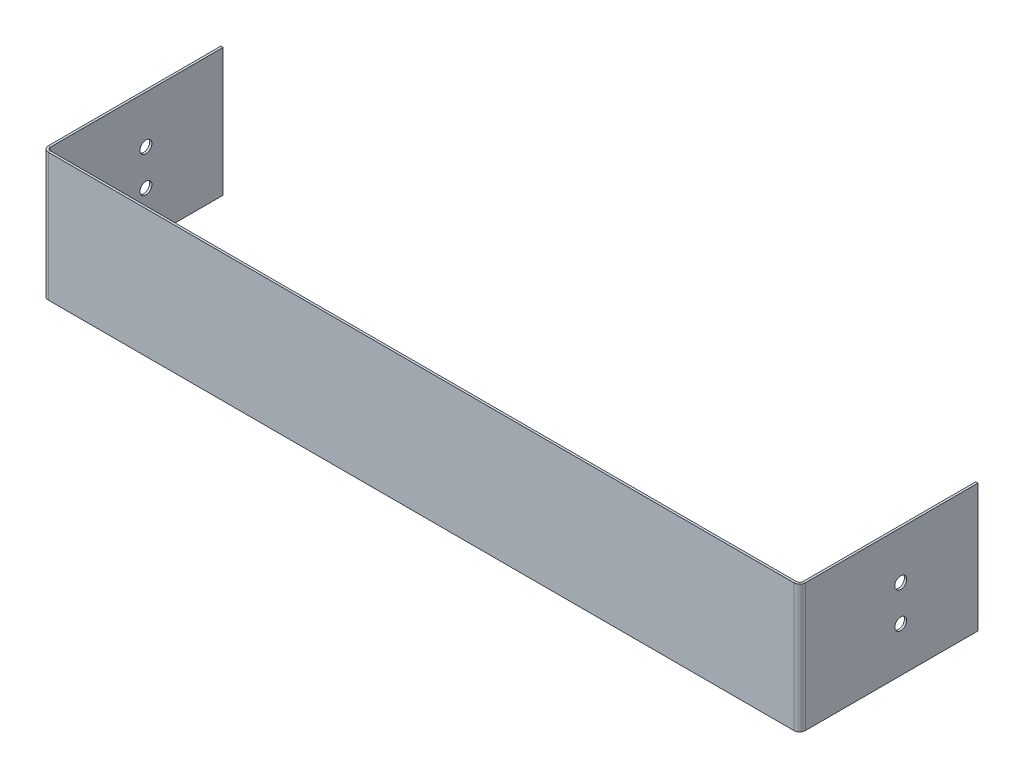
ISO-10303-21;
HEADER;
FILE_DESCRIPTION(('STEP AP214'),'2;1');
FILE_NAME('part.step','',(''),(''),'','','');
FILE_SCHEMA(('AUTOMOTIVE_DESIGN { 1 0 10303 214 1 1 1 1 }'));
ENDSEC;
DATA;
#1=APPLICATION_CONTEXT('core data for automotive mechanical design processes');
#2=APPLICATION_PROTOCOL_DEFINITION('international standard','automotive_design',2000,#1);
#3=PRODUCT_CONTEXT('',#1,'mechanical');
#4=PRODUCT('Part','Part','',(#3));
#5=PRODUCT_RELATED_PRODUCT_CATEGORY('part','',(#4));
#6=PRODUCT_DEFINITION_FORMATION('','',#4);
#7=PRODUCT_DEFINITION_CONTEXT('part definition',#1,'design');
#8=PRODUCT_DEFINITION('design','',#6,#7);
#9=PRODUCT_DEFINITION_SHAPE('','',#8);
#10=(LENGTH_UNIT() NAMED_UNIT(*) SI_UNIT(.MILLI.,.METRE.));
#11=(NAMED_UNIT(*) PLANE_ANGLE_UNIT() SI_UNIT($,.RADIAN.));
#12=(NAMED_UNIT(*) SI_UNIT($,.STERADIAN.) SOLID_ANGLE_UNIT());
#13=UNCERTAINTY_MEASURE_WITH_UNIT(LENGTH_MEASURE(1.E-05),#10,'distance_accuracy_value','');
#14=(GEOMETRIC_REPRESENTATION_CONTEXT(3) GLOBAL_UNCERTAINTY_ASSIGNED_CONTEXT((#13)) GLOBAL_UNIT_ASSIGNED_CONTEXT((#10,
#11,#12)) REPRESENTATION_CONTEXT('',''));
#15=CARTESIAN_POINT('',(0.,0.,0.));
#16=DIRECTION('',(0.,0.,1.));
#17=DIRECTION('',(1.,0.,0.));
#18=AXIS2_PLACEMENT_3D('',#15,#16,#17);
#19=CARTESIAN_POINT('',(0.,0.,-0.4826));
#20=DIRECTION('',(0.,0.,1.));
#21=DIRECTION('',(1.,0.,0.));
#22=AXIS2_PLACEMENT_3D('',#19,#20,#21);
#23=PLANE('',#22);
#24=DIRECTION('',(0.,1.,0.));
#25=VECTOR('',#24,1.);
#26=CARTESIAN_POINT('',(1.2192,27.3545977178884,-0.4826));
#27=LINE('',#26,#25);
#28=CARTESIAN_POINT('',(1.2192,27.3545977178884,-0.4826));
#29=VERTEX_POINT('',#28);
#30=CARTESIAN_POINT('',(1.2192,0.,-0.4826));
#31=VERTEX_POINT('',#30);
#32=EDGE_CURVE('E264',#29,#31,#27,.F.);
#33=ORIENTED_EDGE('',*,*,#32,.F.);
#34=DIRECTION('',(-1.,0.,0.));
#35=VECTOR('',#34,1.);
#36=CARTESIAN_POINT('',(161.72997796623,27.3545977178884,-0.4826));
#37=LINE('',#36,#35);
#38=CARTESIAN_POINT('',(160.51077796623,27.3545977178884,-0.482600000000002));
#39=VERTEX_POINT('',#38);
#40=EDGE_CURVE('E13',#39,#29,#37,.T.);
#41=ORIENTED_EDGE('',*,*,#40,.F.);
#42=DIRECTION('',(0.,-1.,0.));
#43=VECTOR('',#42,1.);
#44=CARTESIAN_POINT('',(160.51077796623,0.,-0.482600000000002));
#45=LINE('',#44,#43);
#46=CARTESIAN_POINT('',(160.51077796623,0.,-0.482600000000002));
#47=VERTEX_POINT('',#46);
#48=EDGE_CURVE('E148',#47,#39,#45,.F.);
#49=ORIENTED_EDGE('',*,*,#48,.F.);
#50=DIRECTION('',(1.,0.,0.));
#51=VECTOR('',#50,1.);
#52=CARTESIAN_POINT('',(0.,0.,-0.4826));
#53=LINE('',#52,#51);
#54=EDGE_CURVE('E88',#31,#47,#53,.T.);
#55=ORIENTED_EDGE('',*,*,#54,.F.);
#56=EDGE_LOOP('',(#33,#41,#49,#55));
#57=FACE_BOUND('',#56,.T.);
#58=ADVANCED_FACE('F79',(#57),#23,.F.);
#59=CARTESIAN_POINT('',(0.,0.,0.));
#60=DIRECTION('',(0.,0.,1.));
#61=DIRECTION('',(1.,0.,0.));
#62=AXIS2_PLACEMENT_3D('',#59,#60,#61);
#63=PLANE('',#62);
#64=DIRECTION('',(-1.,0.,0.));
#65=VECTOR('',#64,1.);
#66=CARTESIAN_POINT('',(161.72997796623,27.3545977178884,0.));
#67=LINE('',#66,#65);
#68=CARTESIAN_POINT('',(160.51077796623,27.3545977178884,0.));
#69=VERTEX_POINT('',#68);
#70=CARTESIAN_POINT('',(1.2192,27.3545977178884,0.));
#71=VERTEX_POINT('',#70);
#72=EDGE_CURVE('E186',#69,#71,#67,.T.);
#73=ORIENTED_EDGE('',*,*,#72,.T.);
#74=DIRECTION('',(0.,1.,0.));
#75=VECTOR('',#74,1.);
#76=CARTESIAN_POINT('',(1.2192,27.3545977178884,0.));
#77=LINE('',#76,#75);
#78=CARTESIAN_POINT('',(1.2192,0.,0.));
#79=VERTEX_POINT('',#78);
#80=EDGE_CURVE('E252',#71,#79,#77,.F.);
#81=ORIENTED_EDGE('',*,*,#80,.T.);
#82=DIRECTION('',(1.,0.,0.));
#83=VECTOR('',#82,1.);
#84=CARTESIAN_POINT('',(0.,0.,0.));
#85=LINE('',#84,#83);
#86=CARTESIAN_POINT('',(160.51077796623,0.,0.));
#87=VERTEX_POINT('',#86);
#88=EDGE_CURVE('E105',#79,#87,#85,.T.);
#89=ORIENTED_EDGE('',*,*,#88,.T.);
#90=DIRECTION('',(0.,-1.,0.));
#91=VECTOR('',#90,1.);
#92=CARTESIAN_POINT('',(160.51077796623,0.,0.));
#93=LINE('',#92,#91);
#94=EDGE_CURVE('E176',#87,#69,#93,.F.);
#95=ORIENTED_EDGE('',*,*,#94,.T.);
#96=EDGE_LOOP('',(#73,#81,#89,#95));
#97=FACE_BOUND('',#96,.T.);
#98=ADVANCED_FACE('F325',(#97),#63,.T.);
#99=CARTESIAN_POINT('',(161.72997796623,27.3545977178884,-0.4826));
#100=DIRECTION('',(0.,1.,0.));
#101=DIRECTION('',(-1.,0.,0.));
#102=AXIS2_PLACEMENT_3D('',#99,#100,#101);
#103=PLANE('',#102);
#104=ORIENTED_EDGE('',*,*,#40,.T.);
#105=DIRECTION('',(0.,0.,1.));
#106=VECTOR('',#105,1.);
#107=CARTESIAN_POINT('',(1.2192,27.3545977178884,-0.4826));
#108=LINE('',#107,#106);
#109=EDGE_CURVE('E258',#29,#71,#108,.T.);
#110=ORIENTED_EDGE('',*,*,#109,.T.);
#111=ORIENTED_EDGE('',*,*,#72,.F.);
#112=DIRECTION('',(0.,0.,1.));
#113=VECTOR('',#112,1.);
#114=CARTESIAN_POINT('',(160.51077796623,27.3545977178884,-0.482600000000002));
#115=LINE('',#114,#113);
#116=EDGE_CURVE('E183',#39,#69,#115,.T.);
#117=ORIENTED_EDGE('',*,*,#116,.F.);
#118=EDGE_LOOP('',(#104,#110,#111,#117));
#119=FACE_BOUND('',#118,.T.);
#120=ADVANCED_FACE('F331',(#119),#103,.T.);
#121=CARTESIAN_POINT('',(0.,0.,-0.4826));
#122=DIRECTION('',(0.,-1.,0.));
#123=DIRECTION('',(0.,0.,-1.));
#124=AXIS2_PLACEMENT_3D('',#121,#122,#123);
#125=PLANE('',#124);
#126=DIRECTION('',(0.,0.,1.));
#127=VECTOR('',#126,1.);
#128=CARTESIAN_POINT('',(1.2192,0.,-0.4826));
#129=LINE('',#128,#127);
#130=EDGE_CURVE('E175',#31,#79,#129,.T.);
#131=ORIENTED_EDGE('',*,*,#130,.F.);
#132=ORIENTED_EDGE('',*,*,#54,.T.);
#133=DIRECTION('',(0.,0.,1.));
#134=VECTOR('',#133,1.);
#135=CARTESIAN_POINT('',(160.51077796623,0.,-0.482600000000002));
#136=LINE('',#135,#134);
#137=EDGE_CURVE('E147',#47,#87,#136,.T.);
#138=ORIENTED_EDGE('',*,*,#137,.T.);
#139=ORIENTED_EDGE('',*,*,#88,.F.);
#140=EDGE_LOOP('',(#131,#132,#138,#139));
#141=FACE_BOUND('',#140,.T.);
#142=ADVANCED_FACE('F81',(#141),#125,.T.);
#143=CARTESIAN_POINT('',(160.51077796623,27.3545977178884,-1.21920000000001));
#144=DIRECTION('',(0.,1.,0.));
#145=DIRECTION('',(0.,0.,1.));
#146=AXIS2_PLACEMENT_3D('',#143,#144,#145);
#147=PLANE('',#146);
#148=DIRECTION('',(-1.,0.,0.));
#149=VECTOR('',#148,1.);
#150=CARTESIAN_POINT('',(161.72997796623,27.3545977178884,-1.2192));
#151=LINE('',#150,#149);
#152=CARTESIAN_POINT('',(161.24737796623,27.3545977178884,-1.2192));
#153=VERTEX_POINT('',#152);
#154=CARTESIAN_POINT('',(161.72997796623,27.3545977178884,-1.2192));
#155=VERTEX_POINT('',#154);
#156=EDGE_CURVE('E136',#153,#155,#151,.F.);
#157=ORIENTED_EDGE('',*,*,#156,.F.);
#158=CARTESIAN_POINT('',(160.51077796623,27.3545977178884,-1.21920000000001));
#159=DIRECTION('',(0.,-1.,0.));
#160=DIRECTION('',(0.,0.,-1.));
#161=AXIS2_PLACEMENT_3D('',#158,#159,#160);
#162=CIRCLE('',#161,0.736600000000004);
#163=EDGE_CURVE('E130',#39,#153,#162,.F.);
#164=ORIENTED_EDGE('',*,*,#163,.F.);
#165=ORIENTED_EDGE('',*,*,#116,.T.);
#166=CARTESIAN_POINT('',(160.51077796623,27.3545977178884,-1.21920000000001));
#167=DIRECTION('',(0.,-1.,0.));
#168=DIRECTION('',(0.,0.,-1.));
#169=AXIS2_PLACEMENT_3D('',#166,#167,#168);
#170=CIRCLE('',#169,1.2192);
#171=EDGE_CURVE('E96',#69,#155,#170,.F.);
#172=ORIENTED_EDGE('',*,*,#171,.T.);
#173=EDGE_LOOP('',(#157,#164,#165,#172));
#174=FACE_BOUND('',#173,.T.);
#175=ADVANCED_FACE('F341',(#174),#147,.T.);
#176=CARTESIAN_POINT('',(160.51077796623,0.,-1.21920000000001));
#177=DIRECTION('',(0.,1.,0.));
#178=DIRECTION('',(0.,0.,1.));
#179=AXIS2_PLACEMENT_3D('',#176,#177,#178);
#180=PLANE('',#179);
#181=CARTESIAN_POINT('',(160.51077796623,0.,-1.21920000000001));
#182=DIRECTION('',(0.,-1.,0.));
#183=DIRECTION('',(0.,0.,-1.));
#184=AXIS2_PLACEMENT_3D('',#181,#182,#183);
#185=CIRCLE('',#184,0.736600000000004);
#186=CARTESIAN_POINT('',(161.24737796623,0.,-1.2192));
#187=VERTEX_POINT('',#186);
#188=EDGE_CURVE('E127',#187,#47,#185,.T.);
#189=ORIENTED_EDGE('',*,*,#188,.F.);
#190=DIRECTION('',(-1.,0.,0.));
#191=VECTOR('',#190,1.);
#192=CARTESIAN_POINT('',(161.24737796623,0.,-1.2192));
#193=LINE('',#192,#191);
#194=CARTESIAN_POINT('',(161.72997796623,0.,-1.2192));
#195=VERTEX_POINT('',#194);
#196=EDGE_CURVE('E135',#187,#195,#193,.F.);
#197=ORIENTED_EDGE('',*,*,#196,.T.);
#198=CARTESIAN_POINT('',(160.51077796623,0.,-1.21920000000001));
#199=DIRECTION('',(0.,-1.,0.));
#200=DIRECTION('',(0.,0.,-1.));
#201=AXIS2_PLACEMENT_3D('',#198,#199,#200);
#202=CIRCLE('',#201,1.2192);
#203=EDGE_CURVE('E178',#195,#87,#202,.T.);
#204=ORIENTED_EDGE('',*,*,#203,.T.);
#205=ORIENTED_EDGE('',*,*,#137,.F.);
#206=EDGE_LOOP('',(#189,#197,#204,#205));
#207=FACE_BOUND('',#206,.T.);
#208=ADVANCED_FACE('F142',(#207),#180,.F.);
#209=CARTESIAN_POINT('',(160.51077796623,0.,-1.21920000000001));
#210=DIRECTION('',(0.,-1.,0.));
#211=DIRECTION('',(1.,0.,0.));
#212=AXIS2_PLACEMENT_3D('',#209,#210,#211);
#213=CYLINDRICAL_SURFACE('',#212,1.2192);
#214=ORIENTED_EDGE('',*,*,#94,.F.);
#215=ORIENTED_EDGE('',*,*,#203,.F.);
#216=DIRECTION('',(0.,-1.,0.));
#217=VECTOR('',#216,1.);
#218=CARTESIAN_POINT('',(161.72997796623,27.3545977178884,-1.2192));
#219=LINE('',#218,#217);
#220=EDGE_CURVE('E161',#195,#155,#219,.F.);
#221=ORIENTED_EDGE('',*,*,#220,.T.);
#222=ORIENTED_EDGE('',*,*,#171,.F.);
#223=EDGE_LOOP('',(#214,#215,#221,#222));
#224=FACE_BOUND('',#223,.T.);
#225=ADVANCED_FACE('F394',(#224),#213,.T.);
#226=CARTESIAN_POINT('',(160.51077796623,0.,-1.21920000000001));
#227=DIRECTION('',(0.,-1.,0.));
#228=DIRECTION('',(1.,0.,0.));
#229=AXIS2_PLACEMENT_3D('',#226,#227,#228);
#230=CYLINDRICAL_SURFACE('',#229,0.736600000000004);
#231=ORIENTED_EDGE('',*,*,#48,.T.);
#232=ORIENTED_EDGE('',*,*,#163,.T.);
#233=DIRECTION('',(0.,-1.,0.));
#234=VECTOR('',#233,1.);
#235=CARTESIAN_POINT('',(161.24737796623,27.3545977178884,-1.2192));
#236=LINE('',#235,#234);
#237=EDGE_CURVE('E124',#153,#187,#236,.T.);
#238=ORIENTED_EDGE('',*,*,#237,.T.);
#239=ORIENTED_EDGE('',*,*,#188,.T.);
#240=EDGE_LOOP('',(#231,#232,#238,#239));
#241=FACE_BOUND('',#240,.T.);
#242=ADVANCED_FACE('F126',(#241),#230,.F.);
#243=CARTESIAN_POINT('',(161.72997796623,0.,-38.1));
#244=DIRECTION('',(0.,1.,0.));
#245=DIRECTION('',(0.,0.,1.));
#246=AXIS2_PLACEMENT_3D('',#243,#244,#245);
#247=PLANE('',#246);
#248=ORIENTED_EDGE('',*,*,#196,.F.);
#249=DIRECTION('',(0.,0.,1.));
#250=VECTOR('',#249,1.);
#251=CARTESIAN_POINT('',(161.24737796623,0.,-38.1));
#252=LINE('',#251,#250);
#253=CARTESIAN_POINT('',(161.24737796623,0.,-38.1));
#254=VERTEX_POINT('',#253);
#255=EDGE_CURVE('E157',#187,#254,#252,.F.);
#256=ORIENTED_EDGE('',*,*,#255,.T.);
#257=DIRECTION('',(-1.,0.,0.));
#258=VECTOR('',#257,1.);
#259=CARTESIAN_POINT('',(161.72997796623,0.,-38.1));
#260=LINE('',#259,#258);
#261=CARTESIAN_POINT('',(161.72997796623,0.,-38.1));
#262=VERTEX_POINT('',#261);
#263=EDGE_CURVE('E149',#262,#254,#260,.T.);
#264=ORIENTED_EDGE('',*,*,#263,.F.);
#265=DIRECTION('',(0.,0.,-1.));
#266=VECTOR('',#265,1.);
#267=CARTESIAN_POINT('',(161.72997796623,0.,5.98338217553696E-13));
#268=LINE('',#267,#266);
#269=EDGE_CURVE('E160',#195,#262,#268,.T.);
#270=ORIENTED_EDGE('',*,*,#269,.F.);
#271=EDGE_LOOP('',(#248,#256,#264,#270));
#272=FACE_BOUND('',#271,.T.);
#273=ADVANCED_FACE('F154',(#272),#247,.F.);
#274=CARTESIAN_POINT('',(161.72997796623,27.3545977178884,-0.482599999999998));
#275=DIRECTION('',(0.,-1.,0.));
#276=DIRECTION('',(0.,0.,-1.));
#277=AXIS2_PLACEMENT_3D('',#274,#275,#276);
#278=PLANE('',#277);
#279=ORIENTED_EDGE('',*,*,#156,.T.);
#280=DIRECTION('',(0.,0.,1.));
#281=VECTOR('',#280,1.);
#282=CARTESIAN_POINT('',(161.72997796623,27.3545977178884,5.98338217553696E-13));
#283=LINE('',#282,#281);
#284=CARTESIAN_POINT('',(161.72997796623,27.3545977178884,-38.1));
#285=VERTEX_POINT('',#284);
#286=EDGE_CURVE('E277',#285,#155,#283,.T.);
#287=ORIENTED_EDGE('',*,*,#286,.F.);
#288=DIRECTION('',(-1.,0.,0.));
#289=VECTOR('',#288,1.);
#290=CARTESIAN_POINT('',(161.72997796623,27.3545977178884,-38.1));
#291=LINE('',#290,#289);
#292=CARTESIAN_POINT('',(161.24737796623,27.3545977178884,-38.1));
#293=VERTEX_POINT('',#292);
#294=EDGE_CURVE('E274',#285,#293,#291,.T.);
#295=ORIENTED_EDGE('',*,*,#294,.T.);
#296=DIRECTION('',(0.,0.,-1.));
#297=VECTOR('',#296,1.);
#298=CARTESIAN_POINT('',(161.24737796623,27.3545977178884,-0.4826));
#299=LINE('',#298,#297);
#300=EDGE_CURVE('E168',#293,#153,#299,.F.);
#301=ORIENTED_EDGE('',*,*,#300,.T.);
#302=EDGE_LOOP('',(#279,#287,#295,#301));
#303=FACE_BOUND('',#302,.T.);
#304=ADVANCED_FACE('F284',(#303),#278,.F.);
#305=CARTESIAN_POINT('',(161.72997796623,0.,5.98338217553696E-13));
#306=DIRECTION('',(-1.,0.,0.));
#307=DIRECTION('',(0.,0.,1.));
#308=AXIS2_PLACEMENT_3D('',#305,#306,#307);
#309=PLANE('',#308);
#310=CARTESIAN_POINT('',(161.72997796623,17.1945977178884,-21.59));
#311=DIRECTION('',(1.,0.,0.));
#312=DIRECTION('',(0.,0.,-1.));
#313=AXIS2_PLACEMENT_3D('',#310,#311,#312);
#314=CIRCLE('',#313,1.27);
#315=CARTESIAN_POINT('',(161.72997796623,17.1945977178884,-22.86));
#316=VERTEX_POINT('',#315);
#317=EDGE_CURVE('E199',#316,#316,#314,.T.);
#318=ORIENTED_EDGE('',*,*,#317,.F.);
#319=EDGE_LOOP('',(#318));
#320=FACE_BOUND('',#319,.T.);
#321=CARTESIAN_POINT('',(161.72997796623,9.57459771788842,-21.59));
#322=DIRECTION('',(1.,0.,0.));
#323=DIRECTION('',(0.,0.,-1.));
#324=AXIS2_PLACEMENT_3D('',#321,#322,#323);
#325=CIRCLE('',#324,1.27);
#326=CARTESIAN_POINT('',(161.72997796623,9.57459771788842,-22.86));
#327=VERTEX_POINT('',#326);
#328=EDGE_CURVE('E209',#327,#327,#325,.T.);
#329=ORIENTED_EDGE('',*,*,#328,.F.);
#330=EDGE_LOOP('',(#329));
#331=FACE_BOUND('',#330,.T.);
#332=ORIENTED_EDGE('',*,*,#220,.F.);
#333=ORIENTED_EDGE('',*,*,#269,.T.);
#334=DIRECTION('',(0.,1.,0.));
#335=VECTOR('',#334,1.);
#336=CARTESIAN_POINT('',(161.72997796623,0.,-38.1));
#337=LINE('',#336,#335);
#338=EDGE_CURVE('E280',#262,#285,#337,.T.);
#339=ORIENTED_EDGE('',*,*,#338,.T.);
#340=ORIENTED_EDGE('',*,*,#286,.T.);
#341=EDGE_LOOP('',(#332,#333,#339,#340));
#342=FACE_BOUND('',#341,.T.);
#343=ADVANCED_FACE('F308',(#320,#331,#342),#309,.F.);
#344=CARTESIAN_POINT('',(161.24737796623,0.,5.9665322865957E-13));
#345=DIRECTION('',(-1.,0.,0.));
#346=DIRECTION('',(0.,0.,1.));
#347=AXIS2_PLACEMENT_3D('',#344,#345,#346);
#348=PLANE('',#347);
#349=CARTESIAN_POINT('',(161.24737796623,17.1945977178884,-21.59));
#350=DIRECTION('',(-1.,0.,0.));
#351=DIRECTION('',(0.,0.,1.));
#352=AXIS2_PLACEMENT_3D('',#349,#350,#351);
#353=CIRCLE('',#352,1.27);
#354=CARTESIAN_POINT('',(161.24737796623,17.1945977178884,-20.32));
#355=VERTEX_POINT('',#354);
#356=EDGE_CURVE('E212',#355,#355,#353,.T.);
#357=ORIENTED_EDGE('',*,*,#356,.F.);
#358=EDGE_LOOP('',(#357));
#359=FACE_BOUND('',#358,.T.);
#360=CARTESIAN_POINT('',(161.24737796623,9.57459771788842,-21.59));
#361=DIRECTION('',(-1.,0.,0.));
#362=DIRECTION('',(0.,0.,1.));
#363=AXIS2_PLACEMENT_3D('',#360,#361,#362);
#364=CIRCLE('',#363,1.27);
#365=CARTESIAN_POINT('',(161.24737796623,9.57459771788842,-20.32));
#366=VERTEX_POINT('',#365);
#367=EDGE_CURVE('E192',#366,#366,#364,.T.);
#368=ORIENTED_EDGE('',*,*,#367,.F.);
#369=EDGE_LOOP('',(#368));
#370=FACE_BOUND('',#369,.T.);
#371=ORIENTED_EDGE('',*,*,#255,.F.);
#372=ORIENTED_EDGE('',*,*,#237,.F.);
#373=ORIENTED_EDGE('',*,*,#300,.F.);
#374=DIRECTION('',(0.,-1.,0.));
#375=VECTOR('',#374,1.);
#376=CARTESIAN_POINT('',(161.24737796623,27.3545977178884,-38.1));
#377=LINE('',#376,#375);
#378=EDGE_CURVE('E165',#254,#293,#377,.F.);
#379=ORIENTED_EDGE('',*,*,#378,.F.);
#380=EDGE_LOOP('',(#371,#372,#373,#379));
#381=FACE_BOUND('',#380,.T.);
#382=ADVANCED_FACE('F163',(#359,#370,#381),#348,.T.);
#383=CARTESIAN_POINT('',(161.72997796623,27.3545977178884,-38.1));
#384=DIRECTION('',(0.,0.,1.));
#385=DIRECTION('',(1.,0.,0.));
#386=AXIS2_PLACEMENT_3D('',#383,#384,#385);
#387=PLANE('',#386);
#388=ORIENTED_EDGE('',*,*,#378,.T.);
#389=ORIENTED_EDGE('',*,*,#294,.F.);
#390=ORIENTED_EDGE('',*,*,#338,.F.);
#391=ORIENTED_EDGE('',*,*,#263,.T.);
#392=EDGE_LOOP('',(#388,#389,#390,#391));
#393=FACE_BOUND('',#392,.T.);
#394=ADVANCED_FACE('F309',(#393),#387,.F.);
#395=CARTESIAN_POINT('',(1.2192,0.,-1.2192));
#396=DIRECTION('',(0.,-1.,0.));
#397=DIRECTION('',(0.,0.,-1.));
#398=AXIS2_PLACEMENT_3D('',#395,#396,#397);
#399=PLANE('',#398);
#400=DIRECTION('',(1.,0.,0.));
#401=VECTOR('',#400,1.);
#402=CARTESIAN_POINT('',(0.,0.,-1.2192));
#403=LINE('',#402,#401);
#404=CARTESIAN_POINT('',(0.482599999999997,0.,-1.2192));
#405=VERTEX_POINT('',#404);
#406=CARTESIAN_POINT('',(0.,0.,-1.2192));
#407=VERTEX_POINT('',#406);
#408=EDGE_CURVE('E215',#405,#407,#403,.F.);
#409=ORIENTED_EDGE('',*,*,#408,.F.);
#410=CARTESIAN_POINT('',(1.2192,0.,-1.2192));
#411=DIRECTION('',(0.,1.,0.));
#412=DIRECTION('',(0.,0.,1.));
#413=AXIS2_PLACEMENT_3D('',#410,#411,#412);
#414=CIRCLE('',#413,0.7366);
#415=EDGE_CURVE('E261',#31,#405,#414,.F.);
#416=ORIENTED_EDGE('',*,*,#415,.F.);
#417=ORIENTED_EDGE('',*,*,#130,.T.);
#418=CARTESIAN_POINT('',(1.2192,0.,-1.2192));
#419=DIRECTION('',(0.,1.,0.));
#420=DIRECTION('',(0.,0.,1.));
#421=AXIS2_PLACEMENT_3D('',#418,#419,#420);
#422=CIRCLE('',#421,1.2192);
#423=EDGE_CURVE('E254',#79,#407,#422,.F.);
#424=ORIENTED_EDGE('',*,*,#423,.T.);
#425=EDGE_LOOP('',(#409,#416,#417,#424));
#426=FACE_BOUND('',#425,.T.);
#427=ADVANCED_FACE('F311',(#426),#399,.T.);
#428=CARTESIAN_POINT('',(1.2192,27.3545977178884,-1.2192));
#429=DIRECTION('',(0.,-1.,0.));
#430=DIRECTION('',(0.,0.,-1.));
#431=AXIS2_PLACEMENT_3D('',#428,#429,#430);
#432=PLANE('',#431);
#433=CARTESIAN_POINT('',(1.2192,27.3545977178884,-1.2192));
#434=DIRECTION('',(0.,1.,0.));
#435=DIRECTION('',(0.,0.,1.));
#436=AXIS2_PLACEMENT_3D('',#433,#434,#435);
#437=CIRCLE('',#436,0.7366);
#438=CARTESIAN_POINT('',(0.482599999999997,27.3545977178884,-1.2192));
#439=VERTEX_POINT('',#438);
#440=EDGE_CURVE('E219',#439,#29,#437,.T.);
#441=ORIENTED_EDGE('',*,*,#440,.F.);
#442=DIRECTION('',(1.,0.,0.));
#443=VECTOR('',#442,1.);
#444=CARTESIAN_POINT('',(0.482599999999997,27.3545977178884,-1.2192));
#445=LINE('',#444,#443);
#446=CARTESIAN_POINT('',(0.,27.3545977178884,-1.2192));
#447=VERTEX_POINT('',#446);
#448=EDGE_CURVE('E244',#439,#447,#445,.F.);
#449=ORIENTED_EDGE('',*,*,#448,.T.);
#450=CARTESIAN_POINT('',(1.2192,27.3545977178884,-1.2192));
#451=DIRECTION('',(0.,1.,0.));
#452=DIRECTION('',(0.,0.,1.));
#453=AXIS2_PLACEMENT_3D('',#450,#451,#452);
#454=CIRCLE('',#453,1.2192);
#455=EDGE_CURVE('E255',#447,#71,#454,.T.);
#456=ORIENTED_EDGE('',*,*,#455,.T.);
#457=ORIENTED_EDGE('',*,*,#109,.F.);
#458=EDGE_LOOP('',(#441,#449,#456,#457));
#459=FACE_BOUND('',#458,.T.);
#460=ADVANCED_FACE('F317',(#459),#432,.F.);
#461=CARTESIAN_POINT('',(1.2192,27.3545977178884,-1.2192));
#462=DIRECTION('',(0.,1.,0.));
#463=DIRECTION('',(-1.,0.,0.));
#464=AXIS2_PLACEMENT_3D('',#461,#462,#463);
#465=CYLINDRICAL_SURFACE('',#464,1.2192);
#466=ORIENTED_EDGE('',*,*,#80,.F.);
#467=ORIENTED_EDGE('',*,*,#455,.F.);
#468=DIRECTION('',(0.,1.,0.));
#469=VECTOR('',#468,1.);
#470=CARTESIAN_POINT('',(0.,0.,-1.2192));
#471=LINE('',#470,#469);
#472=EDGE_CURVE('E241',#447,#407,#471,.F.);
#473=ORIENTED_EDGE('',*,*,#472,.T.);
#474=ORIENTED_EDGE('',*,*,#423,.F.);
#475=EDGE_LOOP('',(#466,#467,#473,#474));
#476=FACE_BOUND('',#475,.T.);
#477=ADVANCED_FACE('F393',(#476),#465,.T.);
#478=CARTESIAN_POINT('',(1.2192,27.3545977178884,-1.2192));
#479=DIRECTION('',(0.,1.,0.));
#480=DIRECTION('',(-1.,0.,0.));
#481=AXIS2_PLACEMENT_3D('',#478,#479,#480);
#482=CYLINDRICAL_SURFACE('',#481,0.7366);
#483=ORIENTED_EDGE('',*,*,#32,.T.);
#484=ORIENTED_EDGE('',*,*,#415,.T.);
#485=DIRECTION('',(0.,1.,0.));
#486=VECTOR('',#485,1.);
#487=CARTESIAN_POINT('',(0.482599999999997,0.,-1.2192));
#488=LINE('',#487,#486);
#489=EDGE_CURVE('E247',#405,#439,#488,.T.);
#490=ORIENTED_EDGE('',*,*,#489,.T.);
#491=ORIENTED_EDGE('',*,*,#440,.T.);
#492=EDGE_LOOP('',(#483,#484,#490,#491));
#493=FACE_BOUND('',#492,.T.);
#494=ADVANCED_FACE('F353',(#493),#482,.F.);
#495=CARTESIAN_POINT('',(-1.31351093196619E-13,27.3545977178884,-38.1));
#496=DIRECTION('',(0.,-1.,0.));
#497=DIRECTION('',(0.,0.,-1.));
#498=AXIS2_PLACEMENT_3D('',#495,#496,#497);
#499=PLANE('',#498);
#500=ORIENTED_EDGE('',*,*,#448,.F.);
#501=DIRECTION('',(0.,0.,1.));
#502=VECTOR('',#501,1.);
#503=CARTESIAN_POINT('',(0.482599999999869,27.3545977178884,-38.1));
#504=LINE('',#503,#502);
#505=CARTESIAN_POINT('',(0.482599999999869,27.3545977178884,-38.1));
#506=VERTEX_POINT('',#505);
#507=EDGE_CURVE('E238',#439,#506,#504,.F.);
#508=ORIENTED_EDGE('',*,*,#507,.T.);
#509=DIRECTION('',(1.,0.,0.));
#510=VECTOR('',#509,1.);
#511=CARTESIAN_POINT('',(-1.31351093196619E-13,27.3545977178884,-38.1));
#512=LINE('',#511,#510);
#513=CARTESIAN_POINT('',(-1.31344925642571E-13,27.3545977178884,-38.1));
#514=VERTEX_POINT('',#513);
#515=EDGE_CURVE('E216',#514,#506,#512,.T.);
#516=ORIENTED_EDGE('',*,*,#515,.F.);
#517=DIRECTION('',(0.,0.,-1.));
#518=VECTOR('',#517,1.);
#519=CARTESIAN_POINT('',(0.,27.3545977178884,0.));
#520=LINE('',#519,#518);
#521=EDGE_CURVE('E229',#447,#514,#520,.T.);
#522=ORIENTED_EDGE('',*,*,#521,.F.);
#523=EDGE_LOOP('',(#500,#508,#516,#522));
#524=FACE_BOUND('',#523,.T.);
#525=ADVANCED_FACE('F388',(#524),#499,.F.);
#526=CARTESIAN_POINT('',(0.,0.,-0.482599999999998));
#527=DIRECTION('',(0.,1.,0.));
#528=DIRECTION('',(0.,0.,1.));
#529=AXIS2_PLACEMENT_3D('',#526,#527,#528);
#530=PLANE('',#529);
#531=ORIENTED_EDGE('',*,*,#408,.T.);
#532=DIRECTION('',(0.,0.,1.));
#533=VECTOR('',#532,1.);
#534=CARTESIAN_POINT('',(0.,0.,0.));
#535=LINE('',#534,#533);
#536=CARTESIAN_POINT('',(-1.31344925642571E-13,0.,-38.1));
#537=VERTEX_POINT('',#536);
#538=EDGE_CURVE('E223',#537,#407,#535,.T.);
#539=ORIENTED_EDGE('',*,*,#538,.F.);
#540=DIRECTION('',(1.,0.,0.));
#541=VECTOR('',#540,1.);
#542=CARTESIAN_POINT('',(-1.31340450115798E-13,0.,-38.1));
#543=LINE('',#542,#541);
#544=CARTESIAN_POINT('',(0.482599999999869,0.,-38.1));
#545=VERTEX_POINT('',#544);
#546=EDGE_CURVE('E220',#537,#545,#543,.T.);
#547=ORIENTED_EDGE('',*,*,#546,.T.);
#548=DIRECTION('',(0.,0.,-1.));
#549=VECTOR('',#548,1.);
#550=CARTESIAN_POINT('',(0.4826,0.,-0.4826));
#551=LINE('',#550,#549);
#552=EDGE_CURVE('E232',#545,#405,#551,.F.);
#553=ORIENTED_EDGE('',*,*,#552,.T.);
#554=EDGE_LOOP('',(#531,#539,#547,#553));
#555=FACE_BOUND('',#554,.T.);
#556=ADVANCED_FACE('F363',(#555),#530,.F.);
#557=CARTESIAN_POINT('',(0.,0.,0.));
#558=DIRECTION('',(1.,0.,0.));
#559=DIRECTION('',(0.,0.,-1.));
#560=AXIS2_PLACEMENT_3D('',#557,#558,#559);
#561=PLANE('',#560);
#562=CARTESIAN_POINT('',(-1.94289029309402E-13,17.1945977178884,-21.5900000000006));
#563=DIRECTION('',(1.,0.,0.));
#564=DIRECTION('',(0.,0.,-1.));
#565=AXIS2_PLACEMENT_3D('',#562,#563,#564);
#566=CIRCLE('',#565,1.27);
#567=CARTESIAN_POINT('',(-1.89603753209533E-13,17.1945977178884,-22.8600000000006));
#568=VERTEX_POINT('',#567);
#569=EDGE_CURVE('E193',#568,#568,#566,.T.);
#570=ORIENTED_EDGE('',*,*,#569,.T.);
#571=EDGE_LOOP('',(#570));
#572=FACE_BOUND('',#571,.T.);
#573=CARTESIAN_POINT('',(-1.94289029309402E-13,9.57459771788842,-21.5900000000006));
#574=DIRECTION('',(1.,0.,0.));
#575=DIRECTION('',(0.,0.,-1.));
#576=AXIS2_PLACEMENT_3D('',#573,#574,#575);
#577=CIRCLE('',#576,1.27);
#578=CARTESIAN_POINT('',(-1.89603753209533E-13,9.57459771788842,-22.8600000000006));
#579=VERTEX_POINT('',#578);
#580=EDGE_CURVE('E204',#579,#579,#577,.T.);
#581=ORIENTED_EDGE('',*,*,#580,.T.);
#582=EDGE_LOOP('',(#581));
#583=FACE_BOUND('',#582,.T.);
#584=ORIENTED_EDGE('',*,*,#472,.F.);
#585=ORIENTED_EDGE('',*,*,#521,.T.);
#586=DIRECTION('',(0.,-1.,0.));
#587=VECTOR('',#586,1.);
#588=CARTESIAN_POINT('',(-1.31344925642571E-13,0.,-38.1));
#589=LINE('',#588,#587);
#590=EDGE_CURVE('E226',#514,#537,#589,.T.);
#591=ORIENTED_EDGE('',*,*,#590,.T.);
#592=ORIENTED_EDGE('',*,*,#538,.T.);
#593=EDGE_LOOP('',(#584,#585,#591,#592));
#594=FACE_BOUND('',#593,.T.);
#595=ADVANCED_FACE('F368',(#572,#583,#594),#561,.F.);
#596=CARTESIAN_POINT('',(0.482600000000002,0.,0.));
#597=DIRECTION('',(1.,0.,0.));
#598=DIRECTION('',(0.,0.,-1.));
#599=AXIS2_PLACEMENT_3D('',#596,#597,#598);
#600=PLANE('',#599);
#601=CARTESIAN_POINT('',(0.482599999999926,17.1945977178884,-21.5900000000006));
#602=DIRECTION('',(1.,0.,0.));
#603=DIRECTION('',(0.,0.,-1.));
#604=AXIS2_PLACEMENT_3D('',#601,#602,#603);
#605=CIRCLE('',#604,1.27);
#606=CARTESIAN_POINT('',(0.482599999999922,17.1945977178884,-22.8600000000006));
#607=VERTEX_POINT('',#606);
#608=EDGE_CURVE('E83',#607,#607,#605,.T.);
#609=ORIENTED_EDGE('',*,*,#608,.F.);
#610=EDGE_LOOP('',(#609));
#611=FACE_BOUND('',#610,.T.);
#612=CARTESIAN_POINT('',(0.482599999999926,9.57459771788842,-21.5900000000006));
#613=DIRECTION('',(1.,0.,0.));
#614=DIRECTION('',(0.,0.,-1.));
#615=AXIS2_PLACEMENT_3D('',#612,#613,#614);
#616=CIRCLE('',#615,1.27);
#617=CARTESIAN_POINT('',(0.482599999999922,9.57459771788842,-22.8600000000006));
#618=VERTEX_POINT('',#617);
#619=EDGE_CURVE('E190',#618,#618,#616,.T.);
#620=ORIENTED_EDGE('',*,*,#619,.F.);
#621=EDGE_LOOP('',(#620));
#622=FACE_BOUND('',#621,.T.);
#623=ORIENTED_EDGE('',*,*,#507,.F.);
#624=ORIENTED_EDGE('',*,*,#489,.F.);
#625=ORIENTED_EDGE('',*,*,#552,.F.);
#626=DIRECTION('',(0.,1.,0.));
#627=VECTOR('',#626,1.);
#628=CARTESIAN_POINT('',(0.482599999999869,0.,-38.1));
#629=LINE('',#628,#627);
#630=EDGE_CURVE('E235',#506,#545,#629,.F.);
#631=ORIENTED_EDGE('',*,*,#630,.F.);
#632=EDGE_LOOP('',(#623,#624,#625,#631));
#633=FACE_BOUND('',#632,.T.);
#634=ADVANCED_FACE('F384',(#611,#622,#633),#600,.T.);
#635=CARTESIAN_POINT('',(-1.31351093196619E-13,0.,-38.1));
#636=DIRECTION('',(0.,0.,1.));
#637=DIRECTION('',(1.,0.,0.));
#638=AXIS2_PLACEMENT_3D('',#635,#636,#637);
#639=PLANE('',#638);
#640=ORIENTED_EDGE('',*,*,#630,.T.);
#641=ORIENTED_EDGE('',*,*,#546,.F.);
#642=ORIENTED_EDGE('',*,*,#590,.F.);
#643=ORIENTED_EDGE('',*,*,#515,.T.);
#644=EDGE_LOOP('',(#640,#641,#642,#643));
#645=FACE_BOUND('',#644,.T.);
#646=ADVANCED_FACE('F377',(#645),#639,.F.);
#647=CARTESIAN_POINT('',(-1.94289029309402E-13,9.57459771788842,-21.5900000000006));
#648=DIRECTION('',(1.,0.,0.));
#649=DIRECTION('',(0.,0.,-1.));
#650=AXIS2_PLACEMENT_3D('',#647,#648,#649);
#651=CYLINDRICAL_SURFACE('',#650,1.27);
#652=ORIENTED_EDGE('',*,*,#619,.T.);
#653=EDGE_LOOP('',(#652));
#654=FACE_BOUND('',#653,.T.);
#655=ORIENTED_EDGE('',*,*,#580,.F.);
#656=EDGE_LOOP('',(#655));
#657=FACE_BOUND('',#656,.T.);
#658=ADVANCED_FACE('F533',(#654,#657),#651,.F.);
#659=CARTESIAN_POINT('',(-1.94289029309402E-13,17.1945977178884,-21.5900000000006));
#660=DIRECTION('',(1.,0.,0.));
#661=DIRECTION('',(0.,0.,-1.));
#662=AXIS2_PLACEMENT_3D('',#659,#660,#661);
#663=CYLINDRICAL_SURFACE('',#662,1.27);
#664=ORIENTED_EDGE('',*,*,#608,.T.);
#665=EDGE_LOOP('',(#664));
#666=FACE_BOUND('',#665,.T.);
#667=ORIENTED_EDGE('',*,*,#569,.F.);
#668=EDGE_LOOP('',(#667));
#669=FACE_BOUND('',#668,.T.);
#670=ADVANCED_FACE('F574',(#666,#669),#663,.F.);
#671=ORIENTED_EDGE('',*,*,#367,.T.);
#672=EDGE_LOOP('',(#671));
#673=FACE_BOUND('',#672,.T.);
#674=ORIENTED_EDGE('',*,*,#328,.T.);
#675=EDGE_LOOP('',(#674));
#676=FACE_BOUND('',#675,.T.);
#677=ADVANCED_FACE('F576',(#673,#676),#651,.F.);
#678=ORIENTED_EDGE('',*,*,#356,.T.);
#679=EDGE_LOOP('',(#678));
#680=FACE_BOUND('',#679,.T.);
#681=ORIENTED_EDGE('',*,*,#317,.T.);
#682=EDGE_LOOP('',(#681));
#683=FACE_BOUND('',#682,.T.);
#684=ADVANCED_FACE('F587',(#680,#683),#663,.F.);
#685=CLOSED_SHELL('',(#58,#98,#120,#142,#175,#208,#225,#242,#273,#304,#343,#382,#394,#427,#460,
#477,#494,#525,#556,#595,#634,#646,#658,#670,#677,#684));
#686=MANIFOLD_SOLID_BREP('B2',#685);
#687=ADVANCED_BREP_SHAPE_REPRESENTATION('',(#18,#686),#14);
#688=SHAPE_DEFINITION_REPRESENTATION(#9,#687);
ENDSEC;
END-ISO-10303-21;
